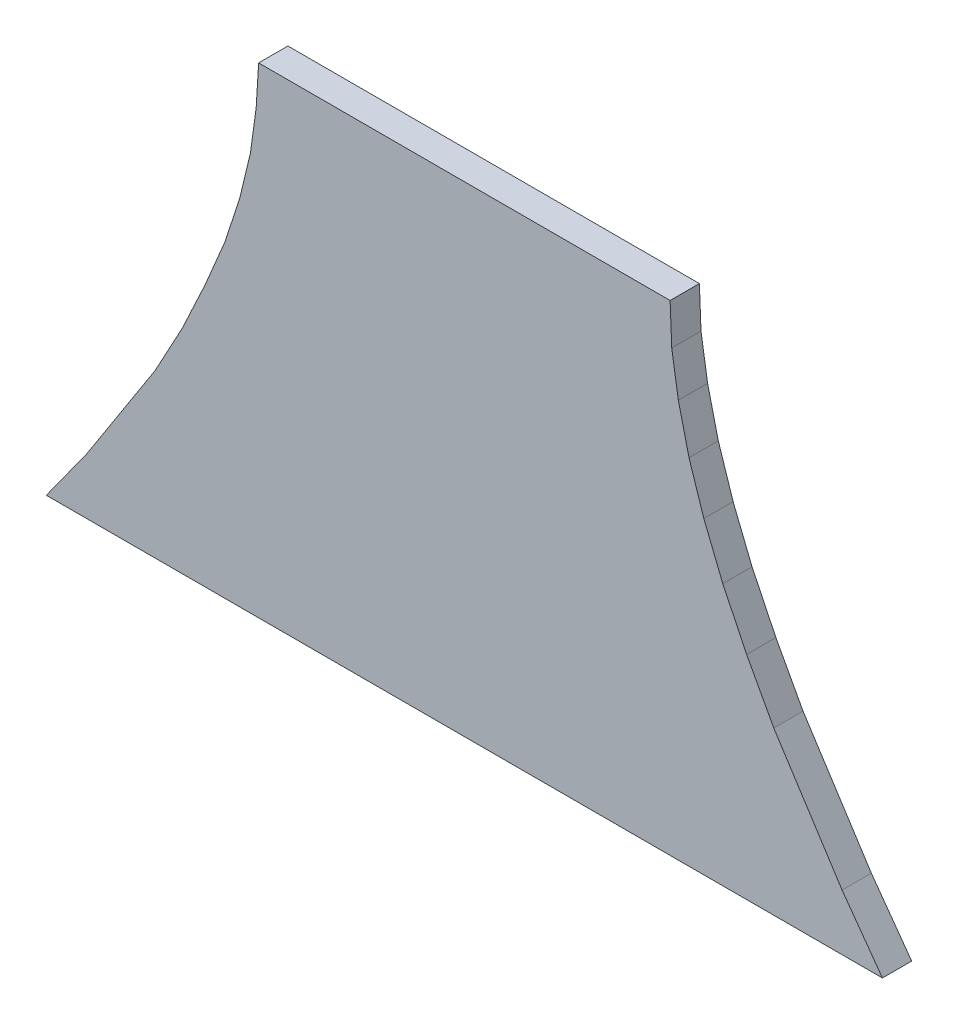
ISO-10303-21;
HEADER;
FILE_DESCRIPTION(('STEP AP214'),'2;1');
FILE_NAME('part.step','',(''),(''),'','','');
FILE_SCHEMA(('AUTOMOTIVE_DESIGN { 1 0 10303 214 1 1 1 1 }'));
ENDSEC;
DATA;
#1=APPLICATION_CONTEXT('core data for automotive mechanical design processes');
#2=APPLICATION_PROTOCOL_DEFINITION('international standard','automotive_design',2000,#1);
#3=PRODUCT_CONTEXT('',#1,'mechanical');
#4=PRODUCT('Part','Part','',(#3));
#5=PRODUCT_RELATED_PRODUCT_CATEGORY('part','',(#4));
#6=PRODUCT_DEFINITION_FORMATION('','',#4);
#7=PRODUCT_DEFINITION_CONTEXT('part definition',#1,'design');
#8=PRODUCT_DEFINITION('design','',#6,#7);
#9=PRODUCT_DEFINITION_SHAPE('','',#8);
#10=(LENGTH_UNIT() NAMED_UNIT(*) SI_UNIT(.MILLI.,.METRE.));
#11=(NAMED_UNIT(*) PLANE_ANGLE_UNIT() SI_UNIT($,.RADIAN.));
#12=(NAMED_UNIT(*) SI_UNIT($,.STERADIAN.) SOLID_ANGLE_UNIT());
#13=UNCERTAINTY_MEASURE_WITH_UNIT(LENGTH_MEASURE(1.E-05),#10,'distance_accuracy_value','');
#14=(GEOMETRIC_REPRESENTATION_CONTEXT(3) GLOBAL_UNCERTAINTY_ASSIGNED_CONTEXT((#13)) GLOBAL_UNIT_ASSIGNED_CONTEXT((#10,
#11,#12)) REPRESENTATION_CONTEXT('',''));
#15=CARTESIAN_POINT('',(0.,0.,0.));
#16=DIRECTION('',(0.,0.,1.));
#17=DIRECTION('',(1.,0.,0.));
#18=AXIS2_PLACEMENT_3D('',#15,#16,#17);
#19=CARTESIAN_POINT('',(50.4290008544922,86.9160003662109,0.));
#20=DIRECTION('',(0.998128614747587,-0.0611495578239414,0.));
#21=DIRECTION('',(-0.0611495578239414,-0.998128614747587,0.));
#22=AXIS2_PLACEMENT_3D('',#19,#20,#21);
#23=PLANE('',#22);
#24=DIRECTION('',(-0.0611495578239414,-0.998128614747587,0.));
#25=VECTOR('',#24,1.);
#26=CARTESIAN_POINT('',(50.4290008544922,86.9160003662109,0.03556));
#27=LINE('',#26,#25);
#28=CARTESIAN_POINT('',(50.4290008544922,86.9160003662109,0.03556));
#29=VERTEX_POINT('',#28);
#30=CARTESIAN_POINT('',(50.4259986877441,86.8669967651367,0.03556));
#31=VERTEX_POINT('',#30);
#32=EDGE_CURVE('E11',#29,#31,#27,.T.);
#33=ORIENTED_EDGE('',*,*,#32,.F.);
#34=DIRECTION('',(0.,0.,1.));
#35=VECTOR('',#34,1.);
#36=CARTESIAN_POINT('',(50.4290008544922,86.9160003662109,0.));
#37=LINE('',#36,#35);
#38=CARTESIAN_POINT('',(50.4290008544922,86.9160003662109,0.));
#39=VERTEX_POINT('',#38);
#40=EDGE_CURVE('E24',#39,#29,#37,.T.);
#41=ORIENTED_EDGE('',*,*,#40,.F.);
#42=DIRECTION('',(-0.0611495578239414,-0.998128614747587,0.));
#43=VECTOR('',#42,1.);
#44=CARTESIAN_POINT('',(50.4290008544922,86.9160003662109,0.));
#45=LINE('',#44,#43);
#46=CARTESIAN_POINT('',(50.4259986877441,86.8669967651367,0.));
#47=VERTEX_POINT('',#46);
#48=EDGE_CURVE('E172',#39,#47,#45,.T.);
#49=ORIENTED_EDGE('',*,*,#48,.T.);
#50=DIRECTION('',(0.,0.,1.));
#51=VECTOR('',#50,1.);
#52=CARTESIAN_POINT('',(50.4259986877441,86.8669967651367,0.));
#53=LINE('',#52,#51);
#54=EDGE_CURVE('E37',#47,#31,#53,.T.);
#55=ORIENTED_EDGE('',*,*,#54,.T.);
#56=EDGE_LOOP('',(#33,#41,#49,#55));
#57=FACE_BOUND('',#56,.T.);
#58=ADVANCED_FACE('F17',(#57),#23,.F.);
#59=CARTESIAN_POINT('',(50.4259986877441,86.8669967651367,0.));
#60=DIRECTION('',(0.990709817647823,-0.135992857224997,0.));
#61=DIRECTION('',(-0.135992857224997,-0.990709817647823,0.));
#62=AXIS2_PLACEMENT_3D('',#59,#60,#61);
#63=PLANE('',#62);
#64=DIRECTION('',(-0.135992857224997,-0.990709817647823,0.));
#65=VECTOR('',#64,1.);
#66=CARTESIAN_POINT('',(50.4259986877441,86.8669967651367,0.03556));
#67=LINE('',#66,#65);
#68=CARTESIAN_POINT('',(50.4189987182617,86.8160018920898,0.03556));
#69=VERTEX_POINT('',#68);
#70=EDGE_CURVE('E308',#31,#69,#67,.T.);
#71=ORIENTED_EDGE('',*,*,#70,.F.);
#72=ORIENTED_EDGE('',*,*,#54,.F.);
#73=DIRECTION('',(-0.135992857224997,-0.990709817647823,0.));
#74=VECTOR('',#73,1.);
#75=CARTESIAN_POINT('',(50.4259986877441,86.8669967651367,0.));
#76=LINE('',#75,#74);
#77=CARTESIAN_POINT('',(50.4189987182617,86.8160018920898,0.));
#78=VERTEX_POINT('',#77);
#79=EDGE_CURVE('E305',#47,#78,#76,.T.);
#80=ORIENTED_EDGE('',*,*,#79,.T.);
#81=DIRECTION('',(0.,0.,1.));
#82=VECTOR('',#81,1.);
#83=CARTESIAN_POINT('',(50.4189987182617,86.8160018920898,0.));
#84=LINE('',#83,#82);
#85=EDGE_CURVE('E303',#78,#69,#84,.T.);
#86=ORIENTED_EDGE('',*,*,#85,.T.);
#87=EDGE_LOOP('',(#71,#72,#80,#86));
#88=FACE_BOUND('',#87,.T.);
#89=ADVANCED_FACE('F316',(#88),#63,.F.);
#90=CARTESIAN_POINT('',(50.4189987182617,86.8160018920898,0.));
#91=DIRECTION('',(0.972222479506538,-0.234058647227909,0.));
#92=DIRECTION('',(-0.234058647227909,-0.972222479506538,0.));
#93=AXIS2_PLACEMENT_3D('',#90,#91,#92);
#94=PLANE('',#93);
#95=DIRECTION('',(-0.234058647227909,-0.972222479506538,0.));
#96=VECTOR('',#95,1.);
#97=CARTESIAN_POINT('',(50.4189987182617,86.8160018920898,0.03556));
#98=LINE('',#97,#96);
#99=CARTESIAN_POINT('',(50.4059982299805,86.7620010375977,0.03556));
#100=VERTEX_POINT('',#99);
#101=EDGE_CURVE('E300',#69,#100,#98,.T.);
#102=ORIENTED_EDGE('',*,*,#101,.F.);
#103=ORIENTED_EDGE('',*,*,#85,.F.);
#104=DIRECTION('',(-0.234058647227909,-0.972222479506538,0.));
#105=VECTOR('',#104,1.);
#106=CARTESIAN_POINT('',(50.4189987182617,86.8160018920898,0.));
#107=LINE('',#106,#105);
#108=CARTESIAN_POINT('',(50.4059982299805,86.7620010375977,0.));
#109=VERTEX_POINT('',#108);
#110=EDGE_CURVE('E297',#78,#109,#107,.T.);
#111=ORIENTED_EDGE('',*,*,#110,.T.);
#112=DIRECTION('',(0.,0.,1.));
#113=VECTOR('',#112,1.);
#114=CARTESIAN_POINT('',(50.4059982299805,86.7620010375977,0.));
#115=LINE('',#114,#113);
#116=EDGE_CURVE('E295',#109,#100,#115,.T.);
#117=ORIENTED_EDGE('',*,*,#116,.T.);
#118=EDGE_LOOP('',(#102,#103,#111,#117));
#119=FACE_BOUND('',#118,.T.);
#120=ADVANCED_FACE('F322',(#119),#94,.F.);
#121=CARTESIAN_POINT('',(50.4059982299805,86.7620010375977,0.));
#122=DIRECTION('',(0.950409174304617,-0.311002253042668,0.));
#123=DIRECTION('',(-0.311002253042668,-0.950409174304617,0.));
#124=AXIS2_PLACEMENT_3D('',#121,#122,#123);
#125=PLANE('',#124);
#126=DIRECTION('',(-0.311002253042668,-0.950409174304617,0.));
#127=VECTOR('',#126,1.);
#128=CARTESIAN_POINT('',(50.4059982299805,86.7620010375977,0.03556));
#129=LINE('',#128,#127);
#130=CARTESIAN_POINT('',(50.3880004882812,86.7070007324219,0.03556));
#131=VERTEX_POINT('',#130);
#132=EDGE_CURVE('E292',#100,#131,#129,.T.);
#133=ORIENTED_EDGE('',*,*,#132,.F.);
#134=ORIENTED_EDGE('',*,*,#116,.F.);
#135=DIRECTION('',(-0.311002253042668,-0.950409174304617,0.));
#136=VECTOR('',#135,1.);
#137=CARTESIAN_POINT('',(50.4059982299805,86.7620010375977,0.));
#138=LINE('',#137,#136);
#139=CARTESIAN_POINT('',(50.3880004882812,86.7070007324219,0.));
#140=VERTEX_POINT('',#139);
#141=EDGE_CURVE('E289',#109,#140,#138,.T.);
#142=ORIENTED_EDGE('',*,*,#141,.T.);
#143=DIRECTION('',(0.,0.,1.));
#144=VECTOR('',#143,1.);
#145=CARTESIAN_POINT('',(50.3880004882812,86.7070007324219,0.));
#146=LINE('',#145,#144);
#147=EDGE_CURVE('E287',#140,#131,#146,.T.);
#148=ORIENTED_EDGE('',*,*,#147,.T.);
#149=EDGE_LOOP('',(#133,#134,#142,#148));
#150=FACE_BOUND('',#149,.T.);
#151=ADVANCED_FACE('F324',(#150),#125,.F.);
#152=CARTESIAN_POINT('',(50.3880004882812,86.7070007324219,0.));
#153=DIRECTION('',(0.92162144213743,-0.388090089273772,0.));
#154=DIRECTION('',(-0.388090089273772,-0.92162144213743,0.));
#155=AXIS2_PLACEMENT_3D('',#152,#153,#154);
#156=PLANE('',#155);
#157=DIRECTION('',(-0.388090089273772,-0.92162144213743,0.));
#158=VECTOR('',#157,1.);
#159=CARTESIAN_POINT('',(50.3880004882812,86.7070007324219,0.03556));
#160=LINE('',#159,#158);
#161=CARTESIAN_POINT('',(50.3639984130859,86.6500015258789,0.03556));
#162=VERTEX_POINT('',#161);
#163=EDGE_CURVE('E284',#131,#162,#160,.T.);
#164=ORIENTED_EDGE('',*,*,#163,.F.);
#165=ORIENTED_EDGE('',*,*,#147,.F.);
#166=DIRECTION('',(-0.388090089273772,-0.92162144213743,0.));
#167=VECTOR('',#166,1.);
#168=CARTESIAN_POINT('',(50.3880004882812,86.7070007324219,0.));
#169=LINE('',#168,#167);
#170=CARTESIAN_POINT('',(50.3639984130859,86.6500015258789,0.));
#171=VERTEX_POINT('',#170);
#172=EDGE_CURVE('E281',#140,#171,#169,.T.);
#173=ORIENTED_EDGE('',*,*,#172,.T.);
#174=DIRECTION('',(0.,0.,1.));
#175=VECTOR('',#174,1.);
#176=CARTESIAN_POINT('',(50.3639984130859,86.6500015258789,0.));
#177=LINE('',#176,#175);
#178=EDGE_CURVE('E279',#171,#162,#177,.T.);
#179=ORIENTED_EDGE('',*,*,#178,.T.);
#180=EDGE_LOOP('',(#164,#165,#173,#179));
#181=FACE_BOUND('',#180,.T.);
#182=ADVANCED_FACE('F329',(#181),#156,.F.);
#183=CARTESIAN_POINT('',(50.3639984130859,86.6500015258789,0.));
#184=DIRECTION('',(0.906197857208785,-0.422853927012872,0.));
#185=DIRECTION('',(-0.422853927012872,-0.906197857208785,0.));
#186=AXIS2_PLACEMENT_3D('',#183,#184,#185);
#187=PLANE('',#186);
#188=DIRECTION('',(-0.422853927012872,-0.906197857208785,0.));
#189=VECTOR('',#188,1.);
#190=CARTESIAN_POINT('',(50.3639984130859,86.6500015258789,0.03556));
#191=LINE('',#190,#189);
#192=CARTESIAN_POINT('',(50.3359985351562,86.5899963378906,0.03556));
#193=VERTEX_POINT('',#192);
#194=EDGE_CURVE('E276',#162,#193,#191,.T.);
#195=ORIENTED_EDGE('',*,*,#194,.F.);
#196=ORIENTED_EDGE('',*,*,#178,.F.);
#197=DIRECTION('',(-0.422853927012872,-0.906197857208785,0.));
#198=VECTOR('',#197,1.);
#199=CARTESIAN_POINT('',(50.3639984130859,86.6500015258789,0.));
#200=LINE('',#199,#198);
#201=CARTESIAN_POINT('',(50.3359985351562,86.5899963378906,0.));
#202=VERTEX_POINT('',#201);
#203=EDGE_CURVE('E273',#171,#202,#200,.T.);
#204=ORIENTED_EDGE('',*,*,#203,.T.);
#205=DIRECTION('',(0.,0.,1.));
#206=VECTOR('',#205,1.);
#207=CARTESIAN_POINT('',(50.3359985351562,86.5899963378906,0.));
#208=LINE('',#207,#206);
#209=EDGE_CURVE('E271',#202,#193,#208,.T.);
#210=ORIENTED_EDGE('',*,*,#209,.T.);
#211=EDGE_LOOP('',(#195,#196,#204,#210));
#212=FACE_BOUND('',#211,.T.);
#213=ADVANCED_FACE('F332',(#212),#187,.F.);
#214=CARTESIAN_POINT('',(50.3359985351562,86.5899963378906,0.));
#215=DIRECTION('',(0.879550993644464,-0.475804633835186,0.));
#216=DIRECTION('',(-0.475804633835186,-0.879550993644464,0.));
#217=AXIS2_PLACEMENT_3D('',#214,#215,#216);
#218=PLANE('',#217);
#219=DIRECTION('',(-0.475804633835186,-0.879550993644464,0.));
#220=VECTOR('',#219,1.);
#221=CARTESIAN_POINT('',(50.3359985351562,86.5899963378906,0.03556));
#222=LINE('',#221,#220);
#223=CARTESIAN_POINT('',(50.3030014038086,86.5289993286133,0.03556));
#224=VERTEX_POINT('',#223);
#225=EDGE_CURVE('E268',#193,#224,#222,.T.);
#226=ORIENTED_EDGE('',*,*,#225,.F.);
#227=ORIENTED_EDGE('',*,*,#209,.F.);
#228=DIRECTION('',(-0.475804633835186,-0.879550993644464,0.));
#229=VECTOR('',#228,1.);
#230=CARTESIAN_POINT('',(50.3359985351562,86.5899963378906,0.));
#231=LINE('',#230,#229);
#232=CARTESIAN_POINT('',(50.3030014038086,86.5289993286133,0.));
#233=VERTEX_POINT('',#232);
#234=EDGE_CURVE('E265',#202,#233,#231,.T.);
#235=ORIENTED_EDGE('',*,*,#234,.T.);
#236=DIRECTION('',(0.,0.,1.));
#237=VECTOR('',#236,1.);
#238=CARTESIAN_POINT('',(50.3030014038086,86.5289993286133,0.));
#239=LINE('',#238,#237);
#240=EDGE_CURVE('E263',#233,#224,#239,.T.);
#241=ORIENTED_EDGE('',*,*,#240,.T.);
#242=EDGE_LOOP('',(#226,#227,#235,#241));
#243=FACE_BOUND('',#242,.T.);
#244=ADVANCED_FACE('F337',(#243),#218,.F.);
#245=CARTESIAN_POINT('',(50.3030014038086,86.5289993286133,0.));
#246=DIRECTION('',(0.840961861215528,-0.541094398400977,0.));
#247=DIRECTION('',(-0.541094398400977,-0.840961861215528,0.));
#248=AXIS2_PLACEMENT_3D('',#245,#246,#247);
#249=PLANE('',#248);
#250=DIRECTION('',(-0.541094398400977,-0.840961861215528,0.));
#251=VECTOR('',#250,1.);
#252=CARTESIAN_POINT('',(50.3030014038086,86.5289993286133,0.03556));
#253=LINE('',#252,#251);
#254=CARTESIAN_POINT('',(50.2200012207031,86.4000015258789,0.03556));
#255=VERTEX_POINT('',#254);
#256=EDGE_CURVE('E260',#224,#255,#253,.T.);
#257=ORIENTED_EDGE('',*,*,#256,.F.);
#258=ORIENTED_EDGE('',*,*,#240,.F.);
#259=DIRECTION('',(-0.541094398400977,-0.840961861215528,0.));
#260=VECTOR('',#259,1.);
#261=CARTESIAN_POINT('',(50.3030014038086,86.5289993286133,0.));
#262=LINE('',#261,#260);
#263=CARTESIAN_POINT('',(50.2200012207031,86.4000015258789,0.));
#264=VERTEX_POINT('',#263);
#265=EDGE_CURVE('E257',#233,#264,#262,.T.);
#266=ORIENTED_EDGE('',*,*,#265,.T.);
#267=DIRECTION('',(0.,0.,1.));
#268=VECTOR('',#267,1.);
#269=CARTESIAN_POINT('',(50.2200012207031,86.4000015258789,0.));
#270=LINE('',#269,#268);
#271=EDGE_CURVE('E255',#264,#255,#270,.T.);
#272=ORIENTED_EDGE('',*,*,#271,.T.);
#273=EDGE_LOOP('',(#257,#258,#266,#272));
#274=FACE_BOUND('',#273,.T.);
#275=ADVANCED_FACE('F340',(#274),#249,.F.);
#276=CARTESIAN_POINT('',(50.2200012207031,86.4000015258789,0.));
#277=DIRECTION('',(0.811312425694803,-0.584612818806785,0.));
#278=DIRECTION('',(-0.584612818806785,-0.811312425694803,0.));
#279=AXIS2_PLACEMENT_3D('',#276,#277,#278);
#280=PLANE('',#279);
#281=DIRECTION('',(-0.584612818806785,-0.811312425694803,0.));
#282=VECTOR('',#281,1.);
#283=CARTESIAN_POINT('',(50.2200012207031,86.4000015258789,0.03556));
#284=LINE('',#283,#282);
#285=CARTESIAN_POINT('',(50.1710014343262,86.3320007324219,0.03556));
#286=VERTEX_POINT('',#285);
#287=EDGE_CURVE('E252',#255,#286,#284,.T.);
#288=ORIENTED_EDGE('',*,*,#287,.F.);
#289=ORIENTED_EDGE('',*,*,#271,.F.);
#290=DIRECTION('',(-0.584612818806785,-0.811312425694803,0.));
#291=VECTOR('',#290,1.);
#292=CARTESIAN_POINT('',(50.2200012207031,86.4000015258789,0.));
#293=LINE('',#292,#291);
#294=CARTESIAN_POINT('',(50.1710014343262,86.3320007324219,0.));
#295=VERTEX_POINT('',#294);
#296=EDGE_CURVE('E249',#264,#295,#293,.T.);
#297=ORIENTED_EDGE('',*,*,#296,.T.);
#298=DIRECTION('',(0.,0.,1.));
#299=VECTOR('',#298,1.);
#300=CARTESIAN_POINT('',(50.1710014343262,86.3320007324219,0.));
#301=LINE('',#300,#299);
#302=EDGE_CURVE('E247',#295,#286,#301,.T.);
#303=ORIENTED_EDGE('',*,*,#302,.T.);
#304=EDGE_LOOP('',(#288,#289,#297,#303));
#305=FACE_BOUND('',#304,.T.);
#306=ADVANCED_FACE('F345',(#305),#280,.F.);
#307=CARTESIAN_POINT('',(50.1710014343262,86.3320007324219,0.));
#308=DIRECTION('',(0.,1.,0.));
#309=DIRECTION('',(1.,0.,0.));
#310=AXIS2_PLACEMENT_3D('',#307,#308,#309);
#311=PLANE('',#310);
#312=DIRECTION('',(1.,0.,0.));
#313=VECTOR('',#312,1.);
#314=CARTESIAN_POINT('',(50.1710014343262,86.3320007324219,0.03556));
#315=LINE('',#314,#313);
#316=CARTESIAN_POINT('',(51.1870002746582,86.3320007324219,0.03556));
#317=VERTEX_POINT('',#316);
#318=EDGE_CURVE('E244',#286,#317,#315,.T.);
#319=ORIENTED_EDGE('',*,*,#318,.F.);
#320=ORIENTED_EDGE('',*,*,#302,.F.);
#321=DIRECTION('',(1.,0.,0.));
#322=VECTOR('',#321,1.);
#323=CARTESIAN_POINT('',(50.1710014343262,86.3320007324219,0.));
#324=LINE('',#323,#322);
#325=CARTESIAN_POINT('',(51.1870002746582,86.3320007324219,0.));
#326=VERTEX_POINT('',#325);
#327=EDGE_CURVE('E241',#295,#326,#324,.T.);
#328=ORIENTED_EDGE('',*,*,#327,.T.);
#329=DIRECTION('',(0.,0.,1.));
#330=VECTOR('',#329,1.);
#331=CARTESIAN_POINT('',(51.1870002746582,86.3320007324219,0.));
#332=LINE('',#331,#330);
#333=EDGE_CURVE('E239',#326,#317,#332,.T.);
#334=ORIENTED_EDGE('',*,*,#333,.T.);
#335=EDGE_LOOP('',(#319,#320,#328,#334));
#336=FACE_BOUND('',#335,.T.);
#337=ADVANCED_FACE('F348',(#336),#311,.F.);
#338=CARTESIAN_POINT('',(51.1870002746582,86.3320007324219,0.));
#339=DIRECTION('',(-0.811312425694803,-0.584612818806785,0.));
#340=DIRECTION('',(-0.584612818806785,0.811312425694803,0.));
#341=AXIS2_PLACEMENT_3D('',#338,#339,#340);
#342=PLANE('',#341);
#343=DIRECTION('',(-0.584612818806785,0.811312425694803,0.));
#344=VECTOR('',#343,1.);
#345=CARTESIAN_POINT('',(51.1870002746582,86.3320007324219,0.03556));
#346=LINE('',#345,#344);
#347=CARTESIAN_POINT('',(51.1380004882812,86.4000015258789,0.03556));
#348=VERTEX_POINT('',#347);
#349=EDGE_CURVE('E236',#317,#348,#346,.T.);
#350=ORIENTED_EDGE('',*,*,#349,.F.);
#351=ORIENTED_EDGE('',*,*,#333,.F.);
#352=DIRECTION('',(-0.584612818806785,0.811312425694803,0.));
#353=VECTOR('',#352,1.);
#354=CARTESIAN_POINT('',(51.1870002746582,86.3320007324219,0.));
#355=LINE('',#354,#353);
#356=CARTESIAN_POINT('',(51.1380004882812,86.4000015258789,0.));
#357=VERTEX_POINT('',#356);
#358=EDGE_CURVE('E233',#326,#357,#355,.T.);
#359=ORIENTED_EDGE('',*,*,#358,.T.);
#360=DIRECTION('',(0.,0.,1.));
#361=VECTOR('',#360,1.);
#362=CARTESIAN_POINT('',(51.1380004882812,86.4000015258789,0.));
#363=LINE('',#362,#361);
#364=EDGE_CURVE('E231',#357,#348,#363,.T.);
#365=ORIENTED_EDGE('',*,*,#364,.T.);
#366=EDGE_LOOP('',(#350,#351,#359,#365));
#367=FACE_BOUND('',#366,.T.);
#368=ADVANCED_FACE('F353',(#367),#342,.F.);
#369=CARTESIAN_POINT('',(51.1380004882812,86.4000015258789,0.));
#370=DIRECTION('',(-0.840961861215528,-0.541094398400977,0.));
#371=DIRECTION('',(-0.541094398400977,0.840961861215528,0.));
#372=AXIS2_PLACEMENT_3D('',#369,#370,#371);
#373=PLANE('',#372);
#374=DIRECTION('',(-0.541094398400977,0.840961861215528,0.));
#375=VECTOR('',#374,1.);
#376=CARTESIAN_POINT('',(51.1380004882812,86.4000015258789,0.03556));
#377=LINE('',#376,#375);
#378=CARTESIAN_POINT('',(51.0550003051758,86.5289993286133,0.03556));
#379=VERTEX_POINT('',#378);
#380=EDGE_CURVE('E228',#348,#379,#377,.T.);
#381=ORIENTED_EDGE('',*,*,#380,.F.);
#382=ORIENTED_EDGE('',*,*,#364,.F.);
#383=DIRECTION('',(-0.541094398400977,0.840961861215528,0.));
#384=VECTOR('',#383,1.);
#385=CARTESIAN_POINT('',(51.1380004882812,86.4000015258789,0.));
#386=LINE('',#385,#384);
#387=CARTESIAN_POINT('',(51.0550003051758,86.5289993286133,0.));
#388=VERTEX_POINT('',#387);
#389=EDGE_CURVE('E225',#357,#388,#386,.T.);
#390=ORIENTED_EDGE('',*,*,#389,.T.);
#391=DIRECTION('',(0.,0.,1.));
#392=VECTOR('',#391,1.);
#393=CARTESIAN_POINT('',(51.0550003051758,86.5289993286133,0.));
#394=LINE('',#393,#392);
#395=EDGE_CURVE('E223',#388,#379,#394,.T.);
#396=ORIENTED_EDGE('',*,*,#395,.T.);
#397=EDGE_LOOP('',(#381,#382,#390,#396));
#398=FACE_BOUND('',#397,.T.);
#399=ADVANCED_FACE('F356',(#398),#373,.F.);
#400=CARTESIAN_POINT('',(51.0550003051758,86.5289993286133,0.));
#401=DIRECTION('',(-0.879527973380277,-0.475847185598047,0.));
#402=DIRECTION('',(-0.475847185598047,0.879527973380277,0.));
#403=AXIS2_PLACEMENT_3D('',#400,#401,#402);
#404=PLANE('',#403);
#405=DIRECTION('',(-0.475847185598047,0.879527973380277,0.));
#406=VECTOR('',#405,1.);
#407=CARTESIAN_POINT('',(51.0550003051758,86.5289993286133,0.03556));
#408=LINE('',#407,#406);
#409=CARTESIAN_POINT('',(51.0219993591309,86.5899963378906,0.03556));
#410=VERTEX_POINT('',#409);
#411=EDGE_CURVE('E220',#379,#410,#408,.T.);
#412=ORIENTED_EDGE('',*,*,#411,.F.);
#413=ORIENTED_EDGE('',*,*,#395,.F.);
#414=DIRECTION('',(-0.475847185598047,0.879527973380277,0.));
#415=VECTOR('',#414,1.);
#416=CARTESIAN_POINT('',(51.0550003051758,86.5289993286133,0.));
#417=LINE('',#416,#415);
#418=CARTESIAN_POINT('',(51.0219993591309,86.5899963378906,0.));
#419=VERTEX_POINT('',#418);
#420=EDGE_CURVE('E217',#388,#419,#417,.T.);
#421=ORIENTED_EDGE('',*,*,#420,.T.);
#422=DIRECTION('',(0.,0.,1.));
#423=VECTOR('',#422,1.);
#424=CARTESIAN_POINT('',(51.0219993591309,86.5899963378906,0.));
#425=LINE('',#424,#423);
#426=EDGE_CURVE('E215',#419,#410,#425,.T.);
#427=ORIENTED_EDGE('',*,*,#426,.T.);
#428=EDGE_LOOP('',(#412,#413,#421,#427));
#429=FACE_BOUND('',#428,.T.);
#430=ADVANCED_FACE('F361',(#429),#404,.F.);
#431=CARTESIAN_POINT('',(51.0219993591309,86.5899963378906,0.));
#432=DIRECTION('',(-0.900367640681196,-0.435129993926157,0.));
#433=DIRECTION('',(-0.435129993926157,0.900367640681196,0.));
#434=AXIS2_PLACEMENT_3D('',#431,#432,#433);
#435=PLANE('',#434);
#436=DIRECTION('',(-0.435129993926157,0.900367640681196,0.));
#437=VECTOR('',#436,1.);
#438=CARTESIAN_POINT('',(51.0219993591309,86.5899963378906,0.03556));
#439=LINE('',#438,#437);
#440=CARTESIAN_POINT('',(50.9930000305176,86.6500015258789,0.03556));
#441=VERTEX_POINT('',#440);
#442=EDGE_CURVE('E212',#410,#441,#439,.T.);
#443=ORIENTED_EDGE('',*,*,#442,.F.);
#444=ORIENTED_EDGE('',*,*,#426,.F.);
#445=DIRECTION('',(-0.435129993926157,0.900367640681196,0.));
#446=VECTOR('',#445,1.);
#447=CARTESIAN_POINT('',(51.0219993591309,86.5899963378906,0.));
#448=LINE('',#447,#446);
#449=CARTESIAN_POINT('',(50.9930000305176,86.6500015258789,0.));
#450=VERTEX_POINT('',#449);
#451=EDGE_CURVE('E209',#419,#450,#448,.T.);
#452=ORIENTED_EDGE('',*,*,#451,.T.);
#453=DIRECTION('',(0.,0.,1.));
#454=VECTOR('',#453,1.);
#455=CARTESIAN_POINT('',(50.9930000305176,86.6500015258789,0.));
#456=LINE('',#455,#454);
#457=EDGE_CURVE('E207',#450,#441,#456,.T.);
#458=ORIENTED_EDGE('',*,*,#457,.T.);
#459=EDGE_LOOP('',(#443,#444,#452,#458));
#460=FACE_BOUND('',#459,.T.);
#461=ADVANCED_FACE('F364',(#460),#435,.F.);
#462=CARTESIAN_POINT('',(50.9930000305176,86.6500015258789,0.));
#463=DIRECTION('',(-0.927355344351169,-0.37418186126979,0.));
#464=DIRECTION('',(-0.37418186126979,0.927355344351169,0.));
#465=AXIS2_PLACEMENT_3D('',#462,#463,#464);
#466=PLANE('',#465);
#467=DIRECTION('',(-0.37418186126979,0.927355344351169,0.));
#468=VECTOR('',#467,1.);
#469=CARTESIAN_POINT('',(50.9930000305176,86.6500015258789,0.03556));
#470=LINE('',#469,#468);
#471=CARTESIAN_POINT('',(50.9700012207031,86.7070007324219,0.03556));
#472=VERTEX_POINT('',#471);
#473=EDGE_CURVE('E204',#441,#472,#470,.T.);
#474=ORIENTED_EDGE('',*,*,#473,.F.);
#475=ORIENTED_EDGE('',*,*,#457,.F.);
#476=DIRECTION('',(-0.37418186126979,0.927355344351169,0.));
#477=VECTOR('',#476,1.);
#478=CARTESIAN_POINT('',(50.9930000305176,86.6500015258789,0.));
#479=LINE('',#478,#477);
#480=CARTESIAN_POINT('',(50.9700012207031,86.7070007324219,0.));
#481=VERTEX_POINT('',#480);
#482=EDGE_CURVE('E201',#450,#481,#479,.T.);
#483=ORIENTED_EDGE('',*,*,#482,.T.);
#484=DIRECTION('',(0.,0.,1.));
#485=VECTOR('',#484,1.);
#486=CARTESIAN_POINT('',(50.9700012207031,86.7070007324219,0.));
#487=LINE('',#486,#485);
#488=EDGE_CURVE('E199',#481,#472,#487,.T.);
#489=ORIENTED_EDGE('',*,*,#488,.T.);
#490=EDGE_LOOP('',(#474,#475,#483,#489));
#491=FACE_BOUND('',#490,.T.);
#492=ADVANCED_FACE('F369',(#491),#466,.F.);
#493=CARTESIAN_POINT('',(50.9700012207031,86.7070007324219,0.));
#494=DIRECTION('',(-0.950389688765753,-0.311061793680509,0.));
#495=DIRECTION('',(-0.311061793680509,0.950389688765753,0.));
#496=AXIS2_PLACEMENT_3D('',#493,#494,#495);
#497=PLANE('',#496);
#498=DIRECTION('',(-0.311061793680509,0.950389688765753,0.));
#499=VECTOR('',#498,1.);
#500=CARTESIAN_POINT('',(50.9700012207031,86.7070007324219,0.03556));
#501=LINE('',#500,#499);
#502=CARTESIAN_POINT('',(50.9519996643066,86.7620010375977,0.03556));
#503=VERTEX_POINT('',#502);
#504=EDGE_CURVE('E196',#472,#503,#501,.T.);
#505=ORIENTED_EDGE('',*,*,#504,.F.);
#506=ORIENTED_EDGE('',*,*,#488,.F.);
#507=DIRECTION('',(-0.311061793680509,0.950389688765753,0.));
#508=VECTOR('',#507,1.);
#509=CARTESIAN_POINT('',(50.9700012207031,86.7070007324219,0.));
#510=LINE('',#509,#508);
#511=CARTESIAN_POINT('',(50.9519996643066,86.7620010375977,0.));
#512=VERTEX_POINT('',#511);
#513=EDGE_CURVE('E193',#481,#512,#510,.T.);
#514=ORIENTED_EDGE('',*,*,#513,.T.);
#515=DIRECTION('',(0.,0.,1.));
#516=VECTOR('',#515,1.);
#517=CARTESIAN_POINT('',(50.9519996643066,86.7620010375977,0.));
#518=LINE('',#517,#516);
#519=EDGE_CURVE('E191',#512,#503,#518,.T.);
#520=ORIENTED_EDGE('',*,*,#519,.T.);
#521=EDGE_LOOP('',(#505,#506,#514,#520));
#522=FACE_BOUND('',#521,.T.);
#523=ADVANCED_FACE('F372',(#522),#497,.F.);
#524=CARTESIAN_POINT('',(50.9519996643066,86.7620010375977,0.));
#525=DIRECTION('',(-0.972222479506538,-0.234058647227909,0.));
#526=DIRECTION('',(-0.234058647227909,0.972222479506538,0.));
#527=AXIS2_PLACEMENT_3D('',#524,#525,#526);
#528=PLANE('',#527);
#529=DIRECTION('',(-0.234058647227909,0.972222479506538,0.));
#530=VECTOR('',#529,1.);
#531=CARTESIAN_POINT('',(50.9519996643066,86.7620010375977,0.03556));
#532=LINE('',#531,#530);
#533=CARTESIAN_POINT('',(50.9389991760254,86.8160018920898,0.03556));
#534=VERTEX_POINT('',#533);
#535=EDGE_CURVE('E188',#503,#534,#532,.T.);
#536=ORIENTED_EDGE('',*,*,#535,.F.);
#537=ORIENTED_EDGE('',*,*,#519,.F.);
#538=DIRECTION('',(-0.234058647227909,0.972222479506538,0.));
#539=VECTOR('',#538,1.);
#540=CARTESIAN_POINT('',(50.9519996643066,86.7620010375977,0.));
#541=LINE('',#540,#539);
#542=CARTESIAN_POINT('',(50.9389991760254,86.8160018920898,0.));
#543=VERTEX_POINT('',#542);
#544=EDGE_CURVE('E185',#512,#543,#541,.T.);
#545=ORIENTED_EDGE('',*,*,#544,.T.);
#546=DIRECTION('',(0.,0.,1.));
#547=VECTOR('',#546,1.);
#548=CARTESIAN_POINT('',(50.9389991760254,86.8160018920898,0.));
#549=LINE('',#548,#547);
#550=EDGE_CURVE('E183',#543,#534,#549,.T.);
#551=ORIENTED_EDGE('',*,*,#550,.T.);
#552=EDGE_LOOP('',(#536,#537,#545,#551));
#553=FACE_BOUND('',#552,.T.);
#554=ADVANCED_FACE('F377',(#553),#528,.F.);
#555=CARTESIAN_POINT('',(50.9389991760254,86.8160018920898,0.));
#556=DIRECTION('',(-0.987918860847228,-0.154972011609563,0.));
#557=DIRECTION('',(-0.154972011609563,0.987918860847228,0.));
#558=AXIS2_PLACEMENT_3D('',#555,#556,#557);
#559=PLANE('',#558);
#560=DIRECTION('',(-0.154972011609563,0.987918860847228,0.));
#561=VECTOR('',#560,1.);
#562=CARTESIAN_POINT('',(50.9389991760254,86.8160018920898,0.03556));
#563=LINE('',#562,#561);
#564=CARTESIAN_POINT('',(50.9309997558594,86.8669967651367,0.03556));
#565=VERTEX_POINT('',#564);
#566=EDGE_CURVE('E180',#534,#565,#563,.T.);
#567=ORIENTED_EDGE('',*,*,#566,.F.);
#568=ORIENTED_EDGE('',*,*,#550,.F.);
#569=DIRECTION('',(-0.154972011609563,0.987918860847228,0.));
#570=VECTOR('',#569,1.);
#571=CARTESIAN_POINT('',(50.9389991760254,86.8160018920898,0.));
#572=LINE('',#571,#570);
#573=CARTESIAN_POINT('',(50.9309997558594,86.8669967651367,0.));
#574=VERTEX_POINT('',#573);
#575=EDGE_CURVE('E178',#543,#574,#572,.T.);
#576=ORIENTED_EDGE('',*,*,#575,.T.);
#577=DIRECTION('',(0.,0.,1.));
#578=VECTOR('',#577,1.);
#579=CARTESIAN_POINT('',(50.9309997558594,86.8669967651367,0.));
#580=LINE('',#579,#578);
#581=EDGE_CURVE('E163',#574,#565,#580,.T.);
#582=ORIENTED_EDGE('',*,*,#581,.T.);
#583=EDGE_LOOP('',(#567,#568,#576,#582));
#584=FACE_BOUND('',#583,.T.);
#585=ADVANCED_FACE('F379',(#584),#559,.F.);
#586=CARTESIAN_POINT('',(50.9309997558594,86.8669967651367,0.));
#587=DIRECTION('',(-0.999169087696928,-0.0407570140084999,0.));
#588=DIRECTION('',(-0.0407570140084999,0.999169087696928,0.));
#589=AXIS2_PLACEMENT_3D('',#586,#587,#588);
#590=PLANE('',#589);
#591=DIRECTION('',(-0.0407570140084999,0.999169087696928,0.));
#592=VECTOR('',#591,1.);
#593=CARTESIAN_POINT('',(50.9309997558594,86.8669967651367,0.03556));
#594=LINE('',#593,#592);
#595=CARTESIAN_POINT('',(50.9290008544922,86.9160003662109,0.03556));
#596=VERTEX_POINT('',#595);
#597=EDGE_CURVE('E167',#565,#596,#594,.T.);
#598=ORIENTED_EDGE('',*,*,#597,.F.);
#599=ORIENTED_EDGE('',*,*,#581,.F.);
#600=DIRECTION('',(-0.0407570140084999,0.999169087696928,0.));
#601=VECTOR('',#600,1.);
#602=CARTESIAN_POINT('',(50.9309997558594,86.8669967651367,0.));
#603=LINE('',#602,#601);
#604=CARTESIAN_POINT('',(50.9290008544922,86.9160003662109,0.));
#605=VERTEX_POINT('',#604);
#606=EDGE_CURVE('E159',#574,#605,#603,.T.);
#607=ORIENTED_EDGE('',*,*,#606,.T.);
#608=DIRECTION('',(0.,0.,1.));
#609=VECTOR('',#608,1.);
#610=CARTESIAN_POINT('',(50.9290008544922,86.9160003662109,0.));
#611=LINE('',#610,#609);
#612=EDGE_CURVE('E149',#605,#596,#611,.T.);
#613=ORIENTED_EDGE('',*,*,#612,.T.);
#614=EDGE_LOOP('',(#598,#599,#607,#613));
#615=FACE_BOUND('',#614,.T.);
#616=ADVANCED_FACE('F162',(#615),#590,.F.);
#617=CARTESIAN_POINT('',(50.9290008544922,86.9160003662109,0.));
#618=DIRECTION('',(0.,-1.,0.));
#619=DIRECTION('',(-1.,0.,0.));
#620=AXIS2_PLACEMENT_3D('',#617,#618,#619);
#621=PLANE('',#620);
#622=DIRECTION('',(-1.,0.,0.));
#623=VECTOR('',#622,1.);
#624=CARTESIAN_POINT('',(50.9290008544922,86.9160003662109,0.03556));
#625=LINE('',#624,#623);
#626=EDGE_CURVE('E155',#596,#29,#625,.T.);
#627=ORIENTED_EDGE('',*,*,#626,.F.);
#628=ORIENTED_EDGE('',*,*,#612,.F.);
#629=DIRECTION('',(-1.,0.,0.));
#630=VECTOR('',#629,1.);
#631=CARTESIAN_POINT('',(50.9290008544922,86.9160003662109,0.));
#632=LINE('',#631,#630);
#633=EDGE_CURVE('E153',#605,#39,#632,.T.);
#634=ORIENTED_EDGE('',*,*,#633,.T.);
#635=ORIENTED_EDGE('',*,*,#40,.T.);
#636=EDGE_LOOP('',(#627,#628,#634,#635));
#637=FACE_BOUND('',#636,.T.);
#638=ADVANCED_FACE('F151',(#637),#621,.F.);
#639=CARTESIAN_POINT('',(50.4290008544922,86.9160003662109,0.));
#640=DIRECTION('',(0.,0.,1.));
#641=DIRECTION('',(1.,0.,0.));
#642=AXIS2_PLACEMENT_3D('',#639,#640,#641);
#643=PLANE('',#642);
#644=ORIENTED_EDGE('',*,*,#633,.F.);
#645=ORIENTED_EDGE('',*,*,#606,.F.);
#646=ORIENTED_EDGE('',*,*,#575,.F.);
#647=ORIENTED_EDGE('',*,*,#544,.F.);
#648=ORIENTED_EDGE('',*,*,#513,.F.);
#649=ORIENTED_EDGE('',*,*,#482,.F.);
#650=ORIENTED_EDGE('',*,*,#451,.F.);
#651=ORIENTED_EDGE('',*,*,#420,.F.);
#652=ORIENTED_EDGE('',*,*,#389,.F.);
#653=ORIENTED_EDGE('',*,*,#358,.F.);
#654=ORIENTED_EDGE('',*,*,#327,.F.);
#655=ORIENTED_EDGE('',*,*,#296,.F.);
#656=ORIENTED_EDGE('',*,*,#265,.F.);
#657=ORIENTED_EDGE('',*,*,#234,.F.);
#658=ORIENTED_EDGE('',*,*,#203,.F.);
#659=ORIENTED_EDGE('',*,*,#172,.F.);
#660=ORIENTED_EDGE('',*,*,#141,.F.);
#661=ORIENTED_EDGE('',*,*,#110,.F.);
#662=ORIENTED_EDGE('',*,*,#79,.F.);
#663=ORIENTED_EDGE('',*,*,#48,.F.);
#664=EDGE_LOOP('',(#644,#645,#646,#647,#648,#649,#650,#651,#652,#653,#654,#655,#656,#657,#658,
#659,#660,#661,#662,#663));
#665=FACE_BOUND('',#664,.T.);
#666=ADVANCED_FACE('F170',(#665),#643,.F.);
#667=CARTESIAN_POINT('',(50.4290008544922,86.9160003662109,0.03556));
#668=DIRECTION('',(0.,0.,1.));
#669=DIRECTION('',(1.,0.,0.));
#670=AXIS2_PLACEMENT_3D('',#667,#668,#669);
#671=PLANE('',#670);
#672=ORIENTED_EDGE('',*,*,#32,.T.);
#673=ORIENTED_EDGE('',*,*,#70,.T.);
#674=ORIENTED_EDGE('',*,*,#101,.T.);
#675=ORIENTED_EDGE('',*,*,#132,.T.);
#676=ORIENTED_EDGE('',*,*,#163,.T.);
#677=ORIENTED_EDGE('',*,*,#194,.T.);
#678=ORIENTED_EDGE('',*,*,#225,.T.);
#679=ORIENTED_EDGE('',*,*,#256,.T.);
#680=ORIENTED_EDGE('',*,*,#287,.T.);
#681=ORIENTED_EDGE('',*,*,#318,.T.);
#682=ORIENTED_EDGE('',*,*,#349,.T.);
#683=ORIENTED_EDGE('',*,*,#380,.T.);
#684=ORIENTED_EDGE('',*,*,#411,.T.);
#685=ORIENTED_EDGE('',*,*,#442,.T.);
#686=ORIENTED_EDGE('',*,*,#473,.T.);
#687=ORIENTED_EDGE('',*,*,#504,.T.);
#688=ORIENTED_EDGE('',*,*,#535,.T.);
#689=ORIENTED_EDGE('',*,*,#566,.T.);
#690=ORIENTED_EDGE('',*,*,#597,.T.);
#691=ORIENTED_EDGE('',*,*,#626,.T.);
#692=EDGE_LOOP('',(#672,#673,#674,#675,#676,#677,#678,#679,#680,#681,#682,#683,#684,#685,#686,
#687,#688,#689,#690,#691));
#693=FACE_BOUND('',#692,.T.);
#694=ADVANCED_FACE('F319',(#693),#671,.T.);
#695=CLOSED_SHELL('',(#58,#89,#120,#151,#182,#213,#244,#275,#306,#337,#368,#399,#430,#461,#492,
#523,#554,#585,#616,#638,#666,#694));
#696=MANIFOLD_SOLID_BREP('B1',#695);
#697=ADVANCED_BREP_SHAPE_REPRESENTATION('',(#18,#696),#14);
#698=SHAPE_DEFINITION_REPRESENTATION(#9,#697);
ENDSEC;
END-ISO-10303-21;
